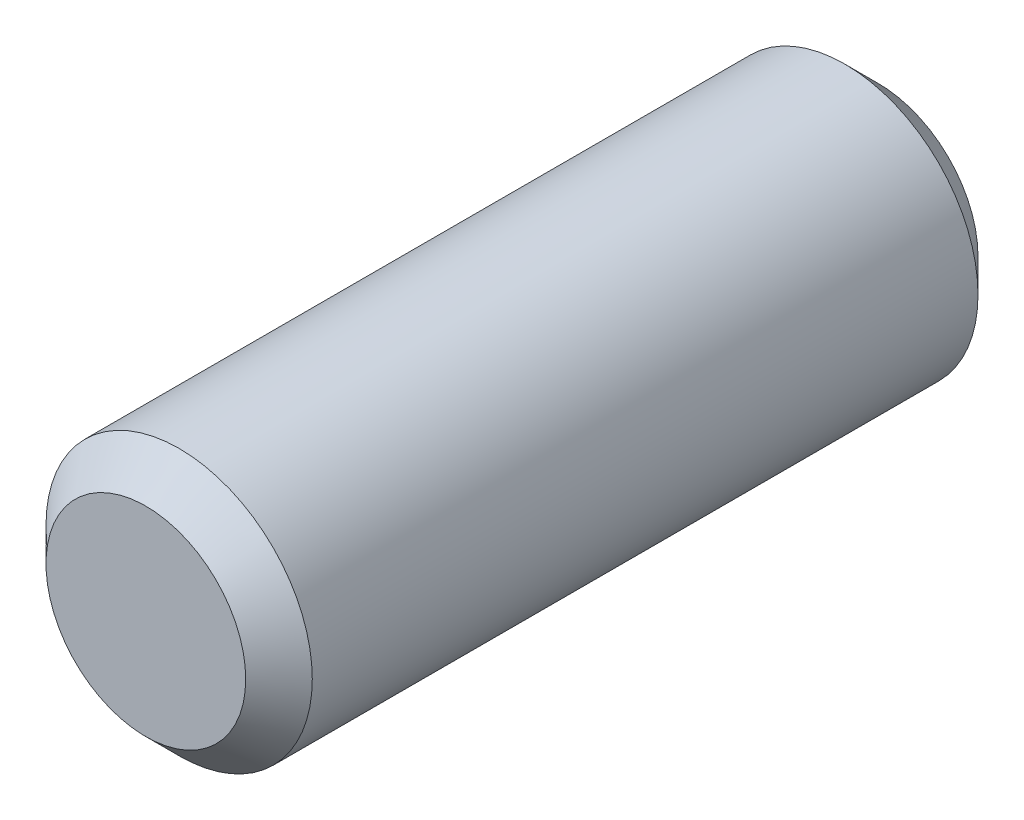
ISO-10303-21;
HEADER;
FILE_DESCRIPTION(('STEP AP214'),'2;1');
FILE_NAME('part.step','',(''),(''),'','','');
FILE_SCHEMA(('AUTOMOTIVE_DESIGN { 1 0 10303 214 1 1 1 1 }'));
ENDSEC;
DATA;
#1=APPLICATION_CONTEXT('core data for automotive mechanical design processes');
#2=APPLICATION_PROTOCOL_DEFINITION('international standard','automotive_design',2000,#1);
#3=PRODUCT_CONTEXT('',#1,'mechanical');
#4=PRODUCT('Part','Part','',(#3));
#5=PRODUCT_RELATED_PRODUCT_CATEGORY('part','',(#4));
#6=PRODUCT_DEFINITION_FORMATION('','',#4);
#7=PRODUCT_DEFINITION_CONTEXT('part definition',#1,'design');
#8=PRODUCT_DEFINITION('design','',#6,#7);
#9=PRODUCT_DEFINITION_SHAPE('','',#8);
#10=(LENGTH_UNIT() NAMED_UNIT(*) SI_UNIT(.MILLI.,.METRE.));
#11=(NAMED_UNIT(*) PLANE_ANGLE_UNIT() SI_UNIT($,.RADIAN.));
#12=(NAMED_UNIT(*) SI_UNIT($,.STERADIAN.) SOLID_ANGLE_UNIT());
#13=UNCERTAINTY_MEASURE_WITH_UNIT(LENGTH_MEASURE(1.E-05),#10,'distance_accuracy_value','');
#14=(GEOMETRIC_REPRESENTATION_CONTEXT(3) GLOBAL_UNCERTAINTY_ASSIGNED_CONTEXT((#13)) GLOBAL_UNIT_ASSIGNED_CONTEXT((#10,
#11,#12)) REPRESENTATION_CONTEXT('',''));
#15=CARTESIAN_POINT('',(0.,0.,0.));
#16=DIRECTION('',(0.,0.,1.));
#17=DIRECTION('',(1.,0.,0.));
#18=AXIS2_PLACEMENT_3D('',#15,#16,#17);
#19=CARTESIAN_POINT('',(0.,0.,5.5));
#20=DIRECTION('',(0.,0.,-1.));
#21=DIRECTION('',(-1.,0.,0.));
#22=AXIS2_PLACEMENT_3D('',#19,#20,#21);
#23=CYLINDRICAL_SURFACE('',#22,2.);
#24=CARTESIAN_POINT('',(0.,0.,-5.));
#25=DIRECTION('',(0.,0.,1.));
#26=DIRECTION('',(1.,0.,0.));
#27=AXIS2_PLACEMENT_3D('',#24,#25,#26);
#28=CIRCLE('',#27,2.);
#29=CARTESIAN_POINT('',(2.,0.,-5.));
#30=VERTEX_POINT('',#29);
#31=EDGE_CURVE('E53',#30,#30,#28,.T.);
#32=ORIENTED_EDGE('',*,*,#31,.T.);
#33=EDGE_LOOP('',(#32));
#34=FACE_BOUND('',#33,.T.);
#35=CARTESIAN_POINT('',(0.,0.,5.));
#36=DIRECTION('',(0.,0.,1.));
#37=DIRECTION('',(1.,0.,0.));
#38=AXIS2_PLACEMENT_3D('',#35,#36,#37);
#39=CIRCLE('',#38,2.);
#40=CARTESIAN_POINT('',(2.,0.,5.));
#41=VERTEX_POINT('',#40);
#42=EDGE_CURVE('E57',#41,#41,#39,.F.);
#43=ORIENTED_EDGE('',*,*,#42,.T.);
#44=EDGE_LOOP('',(#43));
#45=FACE_BOUND('',#44,.T.);
#46=ADVANCED_FACE('F41',(#34,#45),#23,.T.);
#47=CARTESIAN_POINT('',(0.,0.,5.5));
#48=DIRECTION('',(0.,0.,1.));
#49=DIRECTION('',(1.,0.,0.));
#50=AXIS2_PLACEMENT_3D('',#47,#48,#49);
#51=PLANE('',#50);
#52=CARTESIAN_POINT('',(0.,0.,5.5));
#53=DIRECTION('',(0.,0.,1.));
#54=DIRECTION('',(1.,0.,0.));
#55=AXIS2_PLACEMENT_3D('',#52,#53,#54);
#56=CIRCLE('',#55,1.5);
#57=CARTESIAN_POINT('',(1.5,0.,5.5));
#58=VERTEX_POINT('',#57);
#59=EDGE_CURVE('E10',#58,#58,#56,.T.);
#60=ORIENTED_EDGE('',*,*,#59,.T.);
#61=EDGE_LOOP('',(#60));
#62=FACE_BOUND('',#61,.T.);
#63=ADVANCED_FACE('F73',(#62),#51,.T.);
#64=CARTESIAN_POINT('',(0.,0.,-5.5));
#65=DIRECTION('',(0.,0.,1.));
#66=DIRECTION('',(1.,0.,0.));
#67=AXIS2_PLACEMENT_3D('',#64,#65,#66);
#68=PLANE('',#67);
#69=CARTESIAN_POINT('',(0.,0.,-5.5));
#70=DIRECTION('',(0.,0.,1.));
#71=DIRECTION('',(1.,0.,0.));
#72=AXIS2_PLACEMENT_3D('',#69,#70,#71);
#73=CIRCLE('',#72,1.5);
#74=CARTESIAN_POINT('',(1.5,0.,-5.5));
#75=VERTEX_POINT('',#74);
#76=EDGE_CURVE('E49',#75,#75,#73,.F.);
#77=ORIENTED_EDGE('',*,*,#76,.T.);
#78=EDGE_LOOP('',(#77));
#79=FACE_BOUND('',#78,.T.);
#80=ADVANCED_FACE('F70',(#79),#68,.F.);
#81=CARTESIAN_POINT('',(0.,0.,-5.));
#82=DIRECTION('',(0.,0.,1.));
#83=DIRECTION('',(1.,0.,0.));
#84=AXIS2_PLACEMENT_3D('',#81,#82,#83);
#85=CONICAL_SURFACE('',#84,2.,0.78539816339745);
#86=ORIENTED_EDGE('',*,*,#76,.F.);
#87=EDGE_LOOP('',(#86));
#88=FACE_BOUND('',#87,.T.);
#89=ORIENTED_EDGE('',*,*,#31,.F.);
#90=EDGE_LOOP('',(#89));
#91=FACE_BOUND('',#90,.T.);
#92=ADVANCED_FACE('F66',(#88,#91),#85,.T.);
#93=CARTESIAN_POINT('',(0.,0.,5.5));
#94=DIRECTION('',(0.,0.,-1.));
#95=DIRECTION('',(-1.,0.,0.));
#96=AXIS2_PLACEMENT_3D('',#93,#94,#95);
#97=CONICAL_SURFACE('',#96,1.5,0.785398163397447);
#98=ORIENTED_EDGE('',*,*,#42,.F.);
#99=EDGE_LOOP('',(#98));
#100=FACE_BOUND('',#99,.T.);
#101=ORIENTED_EDGE('',*,*,#59,.F.);
#102=EDGE_LOOP('',(#101));
#103=FACE_BOUND('',#102,.T.);
#104=ADVANCED_FACE('F44',(#100,#103),#97,.T.);
#105=CLOSED_SHELL('',(#46,#63,#80,#92,#104));
#106=MANIFOLD_SOLID_BREP('B2',#105);
#107=ADVANCED_BREP_SHAPE_REPRESENTATION('',(#18,#106),#14);
#108=SHAPE_DEFINITION_REPRESENTATION(#9,#107);
ENDSEC;
END-ISO-10303-21;
